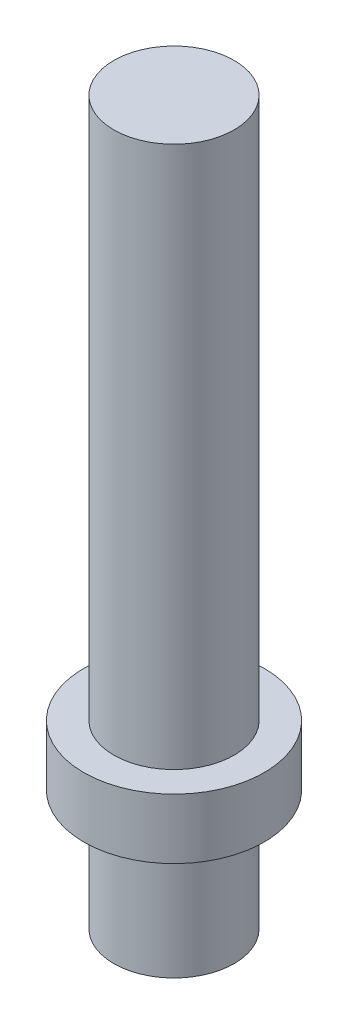
ISO-10303-21;
HEADER;
FILE_DESCRIPTION(('STEP AP214'),'2;1');
FILE_NAME('part.step','',(''),(''),'','','');
FILE_SCHEMA(('AUTOMOTIVE_DESIGN { 1 0 10303 214 1 1 1 1 }'));
ENDSEC;
DATA;
#1=APPLICATION_CONTEXT('core data for automotive mechanical design processes');
#2=APPLICATION_PROTOCOL_DEFINITION('international standard','automotive_design',2000,#1);
#3=PRODUCT_CONTEXT('',#1,'mechanical');
#4=PRODUCT('Part','Part','',(#3));
#5=PRODUCT_RELATED_PRODUCT_CATEGORY('part','',(#4));
#6=PRODUCT_DEFINITION_FORMATION('','',#4);
#7=PRODUCT_DEFINITION_CONTEXT('part definition',#1,'design');
#8=PRODUCT_DEFINITION('design','',#6,#7);
#9=PRODUCT_DEFINITION_SHAPE('','',#8);
#10=(LENGTH_UNIT() NAMED_UNIT(*) SI_UNIT(.MILLI.,.METRE.));
#11=(NAMED_UNIT(*) PLANE_ANGLE_UNIT() SI_UNIT($,.RADIAN.));
#12=(NAMED_UNIT(*) SI_UNIT($,.STERADIAN.) SOLID_ANGLE_UNIT());
#13=UNCERTAINTY_MEASURE_WITH_UNIT(LENGTH_MEASURE(1.E-05),#10,'distance_accuracy_value','');
#14=(GEOMETRIC_REPRESENTATION_CONTEXT(3) GLOBAL_UNCERTAINTY_ASSIGNED_CONTEXT((#13)) GLOBAL_UNIT_ASSIGNED_CONTEXT((#10,
#11,#12)) REPRESENTATION_CONTEXT('',''));
#15=CARTESIAN_POINT('',(0.,0.,0.));
#16=DIRECTION('',(0.,0.,1.));
#17=DIRECTION('',(1.,0.,0.));
#18=AXIS2_PLACEMENT_3D('',#15,#16,#17);
#19=CARTESIAN_POINT('',(0.,3.175,0.));
#20=DIRECTION('',(0.,-1.,0.));
#21=DIRECTION('',(0.,0.,-1.));
#22=AXIS2_PLACEMENT_3D('',#19,#20,#21);
#23=CYLINDRICAL_SURFACE('',#22,1.5875);
#24=CARTESIAN_POINT('',(0.,3.175,0.));
#25=DIRECTION('',(0.,1.,0.));
#26=DIRECTION('',(0.,0.,1.));
#27=AXIS2_PLACEMENT_3D('',#24,#25,#26);
#28=CIRCLE('',#27,1.5875);
#29=CARTESIAN_POINT('',(0.,3.175,1.5875));
#30=VERTEX_POINT('',#29);
#31=EDGE_CURVE('E10',#30,#30,#28,.T.);
#32=ORIENTED_EDGE('',*,*,#31,.F.);
#33=EDGE_LOOP('',(#32));
#34=FACE_BOUND('',#33,.T.);
#35=CARTESIAN_POINT('',(0.,0.,0.));
#36=DIRECTION('',(0.,1.,0.));
#37=DIRECTION('',(0.,0.,1.));
#38=AXIS2_PLACEMENT_3D('',#35,#36,#37);
#39=CIRCLE('',#38,1.5875);
#40=CARTESIAN_POINT('',(0.,0.,1.5875));
#41=VERTEX_POINT('',#40);
#42=EDGE_CURVE('E36',#41,#41,#39,.T.);
#43=ORIENTED_EDGE('',*,*,#42,.T.);
#44=EDGE_LOOP('',(#43));
#45=FACE_BOUND('',#44,.T.);
#46=ADVANCED_FACE('F33',(#34,#45),#23,.T.);
#47=CARTESIAN_POINT('',(0.,0.,0.));
#48=DIRECTION('',(0.,1.,0.));
#49=DIRECTION('',(0.,0.,1.));
#50=AXIS2_PLACEMENT_3D('',#47,#48,#49);
#51=PLANE('',#50);
#52=ORIENTED_EDGE('',*,*,#42,.F.);
#53=EDGE_LOOP('',(#52));
#54=FACE_BOUND('',#53,.T.);
#55=ADVANCED_FACE('F75',(#54),#51,.F.);
#56=CARTESIAN_POINT('',(0.,4.7625,0.));
#57=DIRECTION('',(0.,-1.,0.));
#58=DIRECTION('',(0.,0.,-1.));
#59=AXIS2_PLACEMENT_3D('',#56,#57,#58);
#60=CYLINDRICAL_SURFACE('',#59,2.38125);
#61=CARTESIAN_POINT('',(0.,4.7625,0.));
#62=DIRECTION('',(0.,1.,0.));
#63=DIRECTION('',(0.,0.,1.));
#64=AXIS2_PLACEMENT_3D('',#61,#62,#63);
#65=CIRCLE('',#64,2.38125);
#66=CARTESIAN_POINT('',(0.,4.7625,2.38125));
#67=VERTEX_POINT('',#66);
#68=EDGE_CURVE('E43',#67,#67,#65,.T.);
#69=ORIENTED_EDGE('',*,*,#68,.F.);
#70=EDGE_LOOP('',(#69));
#71=FACE_BOUND('',#70,.T.);
#72=CARTESIAN_POINT('',(0.,3.175,0.));
#73=DIRECTION('',(0.,1.,0.));
#74=DIRECTION('',(0.,0.,1.));
#75=AXIS2_PLACEMENT_3D('',#72,#73,#74);
#76=CIRCLE('',#75,2.38125);
#77=CARTESIAN_POINT('',(0.,3.175,2.38125));
#78=VERTEX_POINT('',#77);
#79=EDGE_CURVE('E45',#78,#78,#76,.T.);
#80=ORIENTED_EDGE('',*,*,#79,.T.);
#81=EDGE_LOOP('',(#80));
#82=FACE_BOUND('',#81,.T.);
#83=ADVANCED_FACE('F69',(#71,#82),#60,.T.);
#84=CARTESIAN_POINT('',(0.,4.7625,0.));
#85=DIRECTION('',(0.,1.,0.));
#86=DIRECTION('',(0.,0.,1.));
#87=AXIS2_PLACEMENT_3D('',#84,#85,#86);
#88=PLANE('',#87);
#89=CARTESIAN_POINT('',(0.,4.7625,0.));
#90=DIRECTION('',(0.,1.,0.));
#91=DIRECTION('',(0.,0.,1.));
#92=AXIS2_PLACEMENT_3D('',#89,#90,#91);
#93=CIRCLE('',#92,1.5875);
#94=CARTESIAN_POINT('',(0.,4.7625,1.5875));
#95=VERTEX_POINT('',#94);
#96=EDGE_CURVE('E51',#95,#95,#93,.T.);
#97=ORIENTED_EDGE('',*,*,#96,.F.);
#98=EDGE_LOOP('',(#97));
#99=FACE_BOUND('',#98,.T.);
#100=ORIENTED_EDGE('',*,*,#68,.T.);
#101=EDGE_LOOP('',(#100));
#102=FACE_BOUND('',#101,.T.);
#103=ADVANCED_FACE('F66',(#99,#102),#88,.T.);
#104=CARTESIAN_POINT('',(0.,3.175,0.));
#105=DIRECTION('',(0.,1.,0.));
#106=DIRECTION('',(0.,0.,1.));
#107=AXIS2_PLACEMENT_3D('',#104,#105,#106);
#108=PLANE('',#107);
#109=ORIENTED_EDGE('',*,*,#31,.T.);
#110=EDGE_LOOP('',(#109));
#111=FACE_BOUND('',#110,.T.);
#112=ORIENTED_EDGE('',*,*,#79,.F.);
#113=EDGE_LOOP('',(#112));
#114=FACE_BOUND('',#113,.T.);
#115=ADVANCED_FACE('F62',(#111,#114),#108,.F.);
#116=CARTESIAN_POINT('',(0.,19.05,0.));
#117=DIRECTION('',(0.,-1.,0.));
#118=DIRECTION('',(0.,0.,-1.));
#119=AXIS2_PLACEMENT_3D('',#116,#117,#118);
#120=CYLINDRICAL_SURFACE('',#119,1.5875);
#121=CARTESIAN_POINT('',(0.,19.05,0.));
#122=DIRECTION('',(0.,1.,0.));
#123=DIRECTION('',(0.,0.,1.));
#124=AXIS2_PLACEMENT_3D('',#121,#122,#123);
#125=CIRCLE('',#124,1.5875);
#126=CARTESIAN_POINT('',(0.,19.05,1.5875));
#127=VERTEX_POINT('',#126);
#128=EDGE_CURVE('E48',#127,#127,#125,.T.);
#129=ORIENTED_EDGE('',*,*,#128,.F.);
#130=EDGE_LOOP('',(#129));
#131=FACE_BOUND('',#130,.T.);
#132=ORIENTED_EDGE('',*,*,#96,.T.);
#133=EDGE_LOOP('',(#132));
#134=FACE_BOUND('',#133,.T.);
#135=ADVANCED_FACE('F59',(#131,#134),#120,.T.);
#136=CARTESIAN_POINT('',(0.,19.05,0.));
#137=DIRECTION('',(0.,1.,0.));
#138=DIRECTION('',(0.,0.,1.));
#139=AXIS2_PLACEMENT_3D('',#136,#137,#138);
#140=PLANE('',#139);
#141=ORIENTED_EDGE('',*,*,#128,.T.);
#142=EDGE_LOOP('',(#141));
#143=FACE_BOUND('',#142,.T.);
#144=ADVANCED_FACE('F57',(#143),#140,.T.);
#145=CLOSED_SHELL('',(#46,#55,#83,#103,#115,#135,#144));
#146=MANIFOLD_SOLID_BREP('B2',#145);
#147=ADVANCED_BREP_SHAPE_REPRESENTATION('',(#18,#146),#14);
#148=SHAPE_DEFINITION_REPRESENTATION(#9,#147);
ENDSEC;
END-ISO-10303-21;
